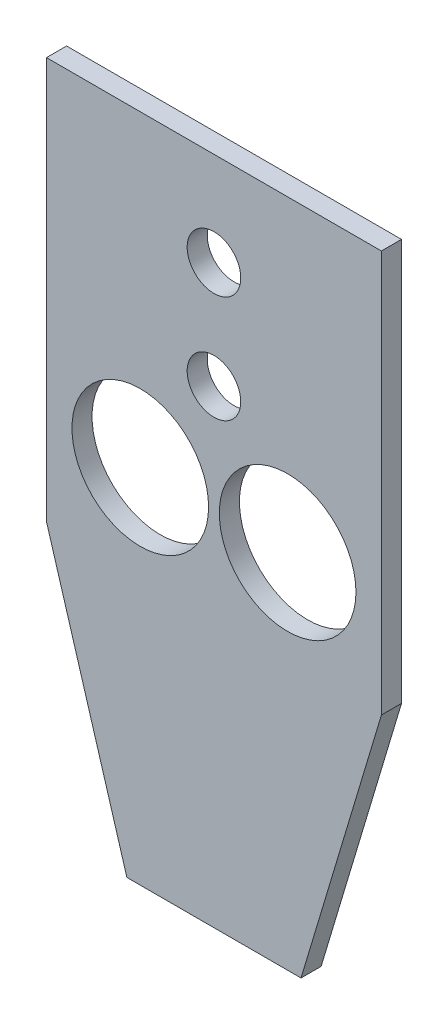
ISO-10303-21;
HEADER;
FILE_DESCRIPTION(('STEP AP214'),'2;1');
FILE_NAME('part.step','',(''),(''),'','','');
FILE_SCHEMA(('AUTOMOTIVE_DESIGN { 1 0 10303 214 1 1 1 1 }'));
ENDSEC;
DATA;
#1=APPLICATION_CONTEXT('core data for automotive mechanical design processes');
#2=APPLICATION_PROTOCOL_DEFINITION('international standard','automotive_design',2000,#1);
#3=PRODUCT_CONTEXT('',#1,'mechanical');
#4=PRODUCT('Part','Part','',(#3));
#5=PRODUCT_RELATED_PRODUCT_CATEGORY('part','',(#4));
#6=PRODUCT_DEFINITION_FORMATION('','',#4);
#7=PRODUCT_DEFINITION_CONTEXT('part definition',#1,'design');
#8=PRODUCT_DEFINITION('design','',#6,#7);
#9=PRODUCT_DEFINITION_SHAPE('','',#8);
#10=(LENGTH_UNIT() NAMED_UNIT(*) SI_UNIT(.MILLI.,.METRE.));
#11=(NAMED_UNIT(*) PLANE_ANGLE_UNIT() SI_UNIT($,.RADIAN.));
#12=(NAMED_UNIT(*) SI_UNIT($,.STERADIAN.) SOLID_ANGLE_UNIT());
#13=UNCERTAINTY_MEASURE_WITH_UNIT(LENGTH_MEASURE(1.E-05),#10,'distance_accuracy_value','');
#14=(GEOMETRIC_REPRESENTATION_CONTEXT(3) GLOBAL_UNCERTAINTY_ASSIGNED_CONTEXT((#13)) GLOBAL_UNIT_ASSIGNED_CONTEXT((#10,
#11,#12)) REPRESENTATION_CONTEXT('',''));
#15=CARTESIAN_POINT('',(0.,0.,0.));
#16=DIRECTION('',(0.,0.,1.));
#17=DIRECTION('',(1.,0.,0.));
#18=AXIS2_PLACEMENT_3D('',#15,#16,#17);
#19=CARTESIAN_POINT('',(0.,0.,15.));
#20=DIRECTION('',(0.,0.,1.));
#21=DIRECTION('',(1.,0.,0.));
#22=AXIS2_PLACEMENT_3D('',#19,#20,#21);
#23=PLANE('',#22);
#24=CARTESIAN_POINT('',(-180.,70.,15.));
#25=DIRECTION('',(0.,0.,1.));
#26=DIRECTION('',(1.,0.,0.));
#27=AXIS2_PLACEMENT_3D('',#24,#25,#26);
#28=CIRCLE('',#27,51.);
#29=CARTESIAN_POINT('',(-129.,70.,15.));
#30=VERTEX_POINT('',#29);
#31=EDGE_CURVE('E132',#30,#30,#28,.T.);
#32=ORIENTED_EDGE('',*,*,#31,.F.);
#33=EDGE_LOOP('',(#32));
#34=FACE_BOUND('',#33,.T.);
#35=CARTESIAN_POINT('',(-125.,230.,15.));
#36=DIRECTION('',(0.,0.,1.));
#37=DIRECTION('',(1.,0.,0.));
#38=AXIS2_PLACEMENT_3D('',#35,#36,#37);
#39=CIRCLE('',#38,20.);
#40=CARTESIAN_POINT('',(-105.,230.,15.));
#41=VERTEX_POINT('',#40);
#42=EDGE_CURVE('E144',#41,#41,#39,.T.);
#43=ORIENTED_EDGE('',*,*,#42,.F.);
#44=EDGE_LOOP('',(#43));
#45=FACE_BOUND('',#44,.T.);
#46=DIRECTION('',(0.,1.,0.));
#47=VECTOR('',#46,1.);
#48=CARTESIAN_POINT('',(0.,0.,15.));
#49=LINE('',#48,#47);
#50=CARTESIAN_POINT('',(0.,0.,15.));
#51=VERTEX_POINT('',#50);
#52=CARTESIAN_POINT('',(0.,300.,15.));
#53=VERTEX_POINT('',#52);
#54=EDGE_CURVE('E49',#51,#53,#49,.T.);
#55=ORIENTED_EDGE('',*,*,#54,.T.);
#56=DIRECTION('',(-1.,0.,0.));
#57=VECTOR('',#56,1.);
#58=CARTESIAN_POINT('',(0.,300.,15.));
#59=LINE('',#58,#57);
#60=CARTESIAN_POINT('',(-250.,300.,15.));
#61=VERTEX_POINT('',#60);
#62=EDGE_CURVE('E73',#53,#61,#59,.T.);
#63=ORIENTED_EDGE('',*,*,#62,.T.);
#64=DIRECTION('',(0.,-1.,0.));
#65=VECTOR('',#64,1.);
#66=CARTESIAN_POINT('',(-250.,0.,15.));
#67=LINE('',#66,#65);
#68=CARTESIAN_POINT('',(-250.,0.,15.));
#69=VERTEX_POINT('',#68);
#70=EDGE_CURVE('E97',#61,#69,#67,.T.);
#71=ORIENTED_EDGE('',*,*,#70,.T.);
#72=DIRECTION('',(0.287347885566346,-0.957826285221151,0.));
#73=VECTOR('',#72,1.);
#74=CARTESIAN_POINT('',(-250.,0.,15.));
#75=LINE('',#74,#73);
#76=CARTESIAN_POINT('',(-190.,-200.,15.));
#77=VERTEX_POINT('',#76);
#78=EDGE_CURVE('E90',#69,#77,#75,.T.);
#79=ORIENTED_EDGE('',*,*,#78,.T.);
#80=DIRECTION('',(1.,0.,0.));
#81=VECTOR('',#80,1.);
#82=CARTESIAN_POINT('',(-190.,-200.,15.));
#83=LINE('',#82,#81);
#84=CARTESIAN_POINT('',(-60.,-200.,15.));
#85=VERTEX_POINT('',#84);
#86=EDGE_CURVE('E94',#77,#85,#83,.T.);
#87=ORIENTED_EDGE('',*,*,#86,.T.);
#88=DIRECTION('',(0.287347885566345,0.957826285221151,0.));
#89=VECTOR('',#88,1.);
#90=CARTESIAN_POINT('',(-60.,-200.,15.));
#91=LINE('',#90,#89);
#92=EDGE_CURVE('E116',#85,#51,#91,.T.);
#93=ORIENTED_EDGE('',*,*,#92,.T.);
#94=EDGE_LOOP('',(#55,#63,#71,#79,#87,#93));
#95=FACE_BOUND('',#94,.T.);
#96=CARTESIAN_POINT('',(-125.,150.,15.));
#97=DIRECTION('',(0.,0.,1.));
#98=DIRECTION('',(1.,0.,0.));
#99=AXIS2_PLACEMENT_3D('',#96,#97,#98);
#100=CIRCLE('',#99,20.);
#101=CARTESIAN_POINT('',(-105.,150.,15.));
#102=VERTEX_POINT('',#101);
#103=EDGE_CURVE('E138',#102,#102,#100,.T.);
#104=ORIENTED_EDGE('',*,*,#103,.F.);
#105=EDGE_LOOP('',(#104));
#106=FACE_BOUND('',#105,.T.);
#107=CARTESIAN_POINT('',(-70.,70.,15.));
#108=DIRECTION('',(0.,0.,1.));
#109=DIRECTION('',(1.,0.,0.));
#110=AXIS2_PLACEMENT_3D('',#107,#108,#109);
#111=CIRCLE('',#110,51.);
#112=CARTESIAN_POINT('',(-19.,70.,15.));
#113=VERTEX_POINT('',#112);
#114=EDGE_CURVE('E126',#113,#113,#111,.T.);
#115=ORIENTED_EDGE('',*,*,#114,.F.);
#116=EDGE_LOOP('',(#115));
#117=FACE_BOUND('',#116,.T.);
#118=ADVANCED_FACE('F32',(#34,#45,#95,#106,#117),#23,.T.);
#119=CARTESIAN_POINT('',(0.,0.,0.));
#120=DIRECTION('',(0.,0.,1.));
#121=DIRECTION('',(1.,0.,0.));
#122=AXIS2_PLACEMENT_3D('',#119,#120,#121);
#123=PLANE('',#122);
#124=DIRECTION('',(0.,1.,0.));
#125=VECTOR('',#124,1.);
#126=CARTESIAN_POINT('',(0.,0.,0.));
#127=LINE('',#126,#125);
#128=CARTESIAN_POINT('',(0.,0.,0.));
#129=VERTEX_POINT('',#128);
#130=CARTESIAN_POINT('',(0.,300.,0.));
#131=VERTEX_POINT('',#130);
#132=EDGE_CURVE('E147',#129,#131,#127,.T.);
#133=ORIENTED_EDGE('',*,*,#132,.F.);
#134=DIRECTION('',(0.287347885566345,0.957826285221151,0.));
#135=VECTOR('',#134,1.);
#136=CARTESIAN_POINT('',(-60.,-200.,0.));
#137=LINE('',#136,#135);
#138=CARTESIAN_POINT('',(-60.,-200.,0.));
#139=VERTEX_POINT('',#138);
#140=EDGE_CURVE('E101',#139,#129,#137,.T.);
#141=ORIENTED_EDGE('',*,*,#140,.F.);
#142=DIRECTION('',(1.,0.,0.));
#143=VECTOR('',#142,1.);
#144=CARTESIAN_POINT('',(-190.,-200.,0.));
#145=LINE('',#144,#143);
#146=CARTESIAN_POINT('',(-190.,-200.,0.));
#147=VERTEX_POINT('',#146);
#148=EDGE_CURVE('E121',#147,#139,#145,.T.);
#149=ORIENTED_EDGE('',*,*,#148,.F.);
#150=DIRECTION('',(0.287347885566346,-0.957826285221151,0.));
#151=VECTOR('',#150,1.);
#152=CARTESIAN_POINT('',(-250.,0.,0.));
#153=LINE('',#152,#151);
#154=CARTESIAN_POINT('',(-250.,0.,0.));
#155=VERTEX_POINT('',#154);
#156=EDGE_CURVE('E107',#155,#147,#153,.T.);
#157=ORIENTED_EDGE('',*,*,#156,.F.);
#158=DIRECTION('',(0.,-1.,0.));
#159=VECTOR('',#158,1.);
#160=CARTESIAN_POINT('',(-250.,0.,0.));
#161=LINE('',#160,#159);
#162=CARTESIAN_POINT('',(-250.,300.,0.));
#163=VERTEX_POINT('',#162);
#164=EDGE_CURVE('E151',#163,#155,#161,.T.);
#165=ORIENTED_EDGE('',*,*,#164,.F.);
#166=DIRECTION('',(-1.,0.,0.));
#167=VECTOR('',#166,1.);
#168=CARTESIAN_POINT('',(0.,300.,0.));
#169=LINE('',#168,#167);
#170=EDGE_CURVE('E63',#131,#163,#169,.T.);
#171=ORIENTED_EDGE('',*,*,#170,.F.);
#172=EDGE_LOOP('',(#133,#141,#149,#157,#165,#171));
#173=FACE_BOUND('',#172,.T.);
#174=CARTESIAN_POINT('',(-125.,230.,0.));
#175=DIRECTION('',(0.,0.,1.));
#176=DIRECTION('',(1.,0.,0.));
#177=AXIS2_PLACEMENT_3D('',#174,#175,#176);
#178=CIRCLE('',#177,20.);
#179=CARTESIAN_POINT('',(-105.,230.,0.));
#180=VERTEX_POINT('',#179);
#181=EDGE_CURVE('E141',#180,#180,#178,.T.);
#182=ORIENTED_EDGE('',*,*,#181,.T.);
#183=EDGE_LOOP('',(#182));
#184=FACE_BOUND('',#183,.T.);
#185=CARTESIAN_POINT('',(-125.,150.,0.));
#186=DIRECTION('',(0.,0.,1.));
#187=DIRECTION('',(1.,0.,0.));
#188=AXIS2_PLACEMENT_3D('',#185,#186,#187);
#189=CIRCLE('',#188,20.);
#190=CARTESIAN_POINT('',(-105.,150.,0.));
#191=VERTEX_POINT('',#190);
#192=EDGE_CURVE('E135',#191,#191,#189,.T.);
#193=ORIENTED_EDGE('',*,*,#192,.T.);
#194=EDGE_LOOP('',(#193));
#195=FACE_BOUND('',#194,.T.);
#196=CARTESIAN_POINT('',(-180.,70.,0.));
#197=DIRECTION('',(0.,0.,1.));
#198=DIRECTION('',(1.,0.,0.));
#199=AXIS2_PLACEMENT_3D('',#196,#197,#198);
#200=CIRCLE('',#199,51.);
#201=CARTESIAN_POINT('',(-129.,70.,0.));
#202=VERTEX_POINT('',#201);
#203=EDGE_CURVE('E129',#202,#202,#200,.T.);
#204=ORIENTED_EDGE('',*,*,#203,.T.);
#205=EDGE_LOOP('',(#204));
#206=FACE_BOUND('',#205,.T.);
#207=CARTESIAN_POINT('',(-70.,70.,0.));
#208=DIRECTION('',(0.,0.,1.));
#209=DIRECTION('',(1.,0.,0.));
#210=AXIS2_PLACEMENT_3D('',#207,#208,#209);
#211=CIRCLE('',#210,51.);
#212=CARTESIAN_POINT('',(-19.,70.,0.));
#213=VERTEX_POINT('',#212);
#214=EDGE_CURVE('E110',#213,#213,#211,.T.);
#215=ORIENTED_EDGE('',*,*,#214,.T.);
#216=EDGE_LOOP('',(#215));
#217=FACE_BOUND('',#216,.T.);
#218=ADVANCED_FACE('F163',(#173,#184,#195,#206,#217),#123,.F.);
#219=CARTESIAN_POINT('',(0.,0.,15.));
#220=DIRECTION('',(-1.,0.,0.));
#221=DIRECTION('',(0.,-1.,0.));
#222=AXIS2_PLACEMENT_3D('',#219,#220,#221);
#223=PLANE('',#222);
#224=ORIENTED_EDGE('',*,*,#132,.T.);
#225=DIRECTION('',(0.,0.,-1.));
#226=VECTOR('',#225,1.);
#227=CARTESIAN_POINT('',(0.,300.,15.));
#228=LINE('',#227,#226);
#229=EDGE_CURVE('E11',#53,#131,#228,.T.);
#230=ORIENTED_EDGE('',*,*,#229,.F.);
#231=ORIENTED_EDGE('',*,*,#54,.F.);
#232=DIRECTION('',(0.,0.,-1.));
#233=VECTOR('',#232,1.);
#234=CARTESIAN_POINT('',(0.,0.,15.));
#235=LINE('',#234,#233);
#236=EDGE_CURVE('E68',#51,#129,#235,.T.);
#237=ORIENTED_EDGE('',*,*,#236,.T.);
#238=EDGE_LOOP('',(#224,#230,#231,#237));
#239=FACE_BOUND('',#238,.T.);
#240=ADVANCED_FACE('F34',(#239),#223,.F.);
#241=CARTESIAN_POINT('',(0.,300.,15.));
#242=DIRECTION('',(0.,-1.,0.));
#243=DIRECTION('',(0.,0.,-1.));
#244=AXIS2_PLACEMENT_3D('',#241,#242,#243);
#245=PLANE('',#244);
#246=ORIENTED_EDGE('',*,*,#170,.T.);
#247=DIRECTION('',(0.,0.,-1.));
#248=VECTOR('',#247,1.);
#249=CARTESIAN_POINT('',(-250.,300.,15.));
#250=LINE('',#249,#248);
#251=EDGE_CURVE('E41',#61,#163,#250,.T.);
#252=ORIENTED_EDGE('',*,*,#251,.F.);
#253=ORIENTED_EDGE('',*,*,#62,.F.);
#254=ORIENTED_EDGE('',*,*,#229,.T.);
#255=EDGE_LOOP('',(#246,#252,#253,#254));
#256=FACE_BOUND('',#255,.T.);
#257=ADVANCED_FACE('F168',(#256),#245,.F.);
#258=CARTESIAN_POINT('',(-250.,0.,15.));
#259=DIRECTION('',(1.,0.,0.));
#260=DIRECTION('',(0.,1.,0.));
#261=AXIS2_PLACEMENT_3D('',#258,#259,#260);
#262=PLANE('',#261);
#263=ORIENTED_EDGE('',*,*,#164,.T.);
#264=DIRECTION('',(0.,0.,-1.));
#265=VECTOR('',#264,1.);
#266=CARTESIAN_POINT('',(-250.,0.,15.));
#267=LINE('',#266,#265);
#268=EDGE_CURVE('E158',#69,#155,#267,.T.);
#269=ORIENTED_EDGE('',*,*,#268,.F.);
#270=ORIENTED_EDGE('',*,*,#70,.F.);
#271=ORIENTED_EDGE('',*,*,#251,.T.);
#272=EDGE_LOOP('',(#263,#269,#270,#271));
#273=FACE_BOUND('',#272,.T.);
#274=ADVANCED_FACE('F161',(#273),#262,.F.);
#275=CARTESIAN_POINT('',(-125.,230.,15.));
#276=DIRECTION('',(0.,0.,-1.));
#277=DIRECTION('',(-1.,0.,0.));
#278=AXIS2_PLACEMENT_3D('',#275,#276,#277);
#279=CYLINDRICAL_SURFACE('',#278,20.);
#280=ORIENTED_EDGE('',*,*,#42,.T.);
#281=EDGE_LOOP('',(#280));
#282=FACE_BOUND('',#281,.T.);
#283=ORIENTED_EDGE('',*,*,#181,.F.);
#284=EDGE_LOOP('',(#283));
#285=FACE_BOUND('',#284,.T.);
#286=ADVANCED_FACE('F175',(#282,#285),#279,.F.);
#287=CARTESIAN_POINT('',(-125.,150.,15.));
#288=DIRECTION('',(0.,0.,-1.));
#289=DIRECTION('',(-1.,0.,0.));
#290=AXIS2_PLACEMENT_3D('',#287,#288,#289);
#291=CYLINDRICAL_SURFACE('',#290,20.);
#292=ORIENTED_EDGE('',*,*,#103,.T.);
#293=EDGE_LOOP('',(#292));
#294=FACE_BOUND('',#293,.T.);
#295=ORIENTED_EDGE('',*,*,#192,.F.);
#296=EDGE_LOOP('',(#295));
#297=FACE_BOUND('',#296,.T.);
#298=ADVANCED_FACE('F191',(#294,#297),#291,.F.);
#299=CARTESIAN_POINT('',(-180.,70.,15.));
#300=DIRECTION('',(0.,0.,-1.));
#301=DIRECTION('',(-1.,0.,0.));
#302=AXIS2_PLACEMENT_3D('',#299,#300,#301);
#303=CYLINDRICAL_SURFACE('',#302,51.);
#304=ORIENTED_EDGE('',*,*,#31,.T.);
#305=EDGE_LOOP('',(#304));
#306=FACE_BOUND('',#305,.T.);
#307=ORIENTED_EDGE('',*,*,#203,.F.);
#308=EDGE_LOOP('',(#307));
#309=FACE_BOUND('',#308,.T.);
#310=ADVANCED_FACE('F195',(#306,#309),#303,.F.);
#311=CARTESIAN_POINT('',(-70.,70.,15.));
#312=DIRECTION('',(0.,0.,-1.));
#313=DIRECTION('',(-1.,0.,0.));
#314=AXIS2_PLACEMENT_3D('',#311,#312,#313);
#315=CYLINDRICAL_SURFACE('',#314,51.);
#316=ORIENTED_EDGE('',*,*,#114,.T.);
#317=EDGE_LOOP('',(#316));
#318=FACE_BOUND('',#317,.T.);
#319=ORIENTED_EDGE('',*,*,#214,.F.);
#320=EDGE_LOOP('',(#319));
#321=FACE_BOUND('',#320,.T.);
#322=ADVANCED_FACE('F199',(#318,#321),#315,.F.);
#323=CARTESIAN_POINT('',(-250.,0.,15.));
#324=DIRECTION('',(0.957826285221151,0.287347885566346,0.));
#325=DIRECTION('',(-0.287347885566346,0.957826285221152,0.));
#326=AXIS2_PLACEMENT_3D('',#323,#324,#325);
#327=PLANE('',#326);
#328=ORIENTED_EDGE('',*,*,#156,.T.);
#329=DIRECTION('',(0.,0.,-1.));
#330=VECTOR('',#329,1.);
#331=CARTESIAN_POINT('',(-190.,-200.,15.));
#332=LINE('',#331,#330);
#333=EDGE_CURVE('E104',#77,#147,#332,.T.);
#334=ORIENTED_EDGE('',*,*,#333,.F.);
#335=ORIENTED_EDGE('',*,*,#78,.F.);
#336=ORIENTED_EDGE('',*,*,#268,.T.);
#337=EDGE_LOOP('',(#328,#334,#335,#336));
#338=FACE_BOUND('',#337,.T.);
#339=ADVANCED_FACE('F105',(#338),#327,.F.);
#340=CARTESIAN_POINT('',(-190.,-200.,15.));
#341=DIRECTION('',(0.,1.,0.));
#342=DIRECTION('',(0.,0.,1.));
#343=AXIS2_PLACEMENT_3D('',#340,#341,#342);
#344=PLANE('',#343);
#345=ORIENTED_EDGE('',*,*,#148,.T.);
#346=DIRECTION('',(0.,0.,-1.));
#347=VECTOR('',#346,1.);
#348=CARTESIAN_POINT('',(-60.,-200.,15.));
#349=LINE('',#348,#347);
#350=EDGE_CURVE('E111',#85,#139,#349,.T.);
#351=ORIENTED_EDGE('',*,*,#350,.F.);
#352=ORIENTED_EDGE('',*,*,#86,.F.);
#353=ORIENTED_EDGE('',*,*,#333,.T.);
#354=EDGE_LOOP('',(#345,#351,#352,#353));
#355=FACE_BOUND('',#354,.T.);
#356=ADVANCED_FACE('F113',(#355),#344,.F.);
#357=CARTESIAN_POINT('',(-60.,-200.,15.));
#358=DIRECTION('',(-0.957826285221151,0.287347885566345,0.));
#359=DIRECTION('',(-0.287347885566345,-0.957826285221152,0.));
#360=AXIS2_PLACEMENT_3D('',#357,#358,#359);
#361=PLANE('',#360);
#362=ORIENTED_EDGE('',*,*,#140,.T.);
#363=ORIENTED_EDGE('',*,*,#236,.F.);
#364=ORIENTED_EDGE('',*,*,#92,.F.);
#365=ORIENTED_EDGE('',*,*,#350,.T.);
#366=EDGE_LOOP('',(#362,#363,#364,#365));
#367=FACE_BOUND('',#366,.T.);
#368=ADVANCED_FACE('F167',(#367),#361,.F.);
#369=CLOSED_SHELL('',(#118,#218,#240,#257,#274,#286,#298,#310,#322,#339,#356,#368));
#370=MANIFOLD_SOLID_BREP('B2',#369);
#371=ADVANCED_BREP_SHAPE_REPRESENTATION('',(#18,#370),#14);
#372=SHAPE_DEFINITION_REPRESENTATION(#9,#371);
ENDSEC;
END-ISO-10303-21;
